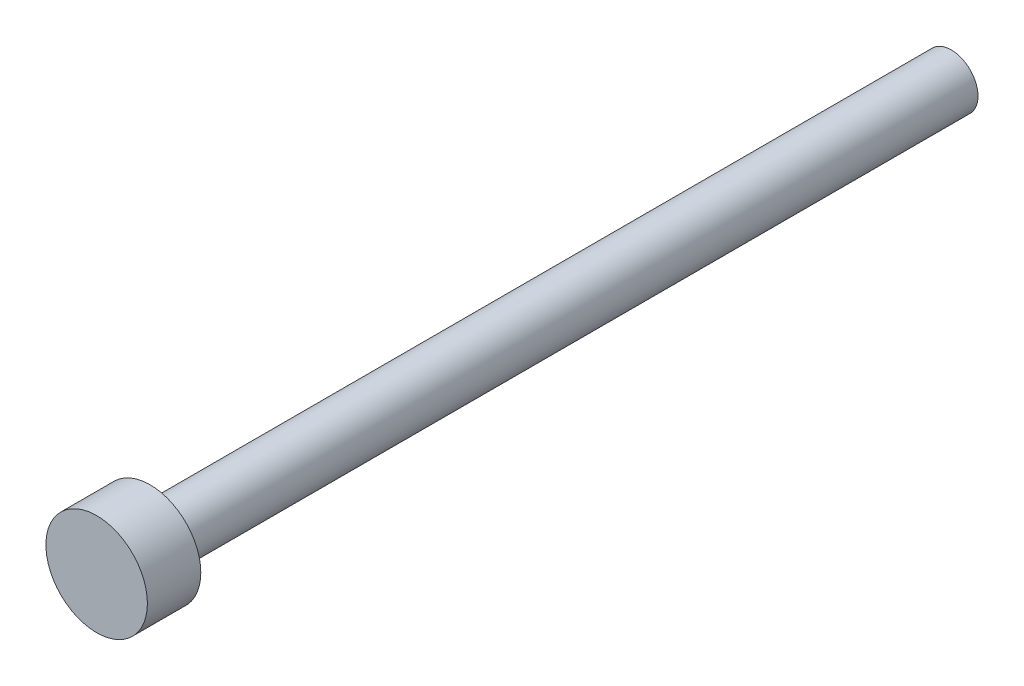
ISO-10303-21;
HEADER;
FILE_DESCRIPTION(('STEP AP214'),'2;1');
FILE_NAME('part.step','',(''),(''),'','','');
FILE_SCHEMA(('AUTOMOTIVE_DESIGN { 1 0 10303 214 1 1 1 1 }'));
ENDSEC;
DATA;
#1=APPLICATION_CONTEXT('core data for automotive mechanical design processes');
#2=APPLICATION_PROTOCOL_DEFINITION('international standard','automotive_design',2000,#1);
#3=PRODUCT_CONTEXT('',#1,'mechanical');
#4=PRODUCT('Part','Part','',(#3));
#5=PRODUCT_RELATED_PRODUCT_CATEGORY('part','',(#4));
#6=PRODUCT_DEFINITION_FORMATION('','',#4);
#7=PRODUCT_DEFINITION_CONTEXT('part definition',#1,'design');
#8=PRODUCT_DEFINITION('design','',#6,#7);
#9=PRODUCT_DEFINITION_SHAPE('','',#8);
#10=(LENGTH_UNIT() NAMED_UNIT(*) SI_UNIT(.MILLI.,.METRE.));
#11=(NAMED_UNIT(*) PLANE_ANGLE_UNIT() SI_UNIT($,.RADIAN.));
#12=(NAMED_UNIT(*) SI_UNIT($,.STERADIAN.) SOLID_ANGLE_UNIT());
#13=UNCERTAINTY_MEASURE_WITH_UNIT(LENGTH_MEASURE(1.E-05),#10,'distance_accuracy_value','');
#14=(GEOMETRIC_REPRESENTATION_CONTEXT(3) GLOBAL_UNCERTAINTY_ASSIGNED_CONTEXT((#13)) GLOBAL_UNIT_ASSIGNED_CONTEXT((#10,
#11,#12)) REPRESENTATION_CONTEXT('',''));
#15=CARTESIAN_POINT('',(0.,0.,0.));
#16=DIRECTION('',(0.,0.,1.));
#17=DIRECTION('',(1.,0.,0.));
#18=AXIS2_PLACEMENT_3D('',#15,#16,#17);
#19=CARTESIAN_POINT('',(0.,0.,0.));
#20=DIRECTION('',(0.,0.,-1.));
#21=DIRECTION('',(-1.,0.,0.));
#22=AXIS2_PLACEMENT_3D('',#19,#20,#21);
#23=CYLINDRICAL_SURFACE('',#22,1.);
#24=CARTESIAN_POINT('',(0.,0.,0.));
#25=DIRECTION('',(0.,0.,1.));
#26=DIRECTION('',(1.,0.,0.));
#27=AXIS2_PLACEMENT_3D('',#24,#25,#26);
#28=CIRCLE('',#27,1.);
#29=CARTESIAN_POINT('',(1.,0.,0.));
#30=VERTEX_POINT('',#29);
#31=EDGE_CURVE('E10',#30,#30,#28,.T.);
#32=ORIENTED_EDGE('',*,*,#31,.F.);
#33=EDGE_LOOP('',(#32));
#34=FACE_BOUND('',#33,.T.);
#35=CARTESIAN_POINT('',(0.,0.,-30.));
#36=DIRECTION('',(0.,0.,1.));
#37=DIRECTION('',(1.,0.,0.));
#38=AXIS2_PLACEMENT_3D('',#35,#36,#37);
#39=CIRCLE('',#38,1.);
#40=CARTESIAN_POINT('',(1.,0.,-30.));
#41=VERTEX_POINT('',#40);
#42=EDGE_CURVE('E37',#41,#41,#39,.T.);
#43=ORIENTED_EDGE('',*,*,#42,.T.);
#44=EDGE_LOOP('',(#43));
#45=FACE_BOUND('',#44,.T.);
#46=ADVANCED_FACE('F40',(#34,#45),#23,.T.);
#47=CARTESIAN_POINT('',(0.,0.,-30.));
#48=DIRECTION('',(0.,0.,1.));
#49=DIRECTION('',(1.,0.,0.));
#50=AXIS2_PLACEMENT_3D('',#47,#48,#49);
#51=PLANE('',#50);
#52=ORIENTED_EDGE('',*,*,#42,.F.);
#53=EDGE_LOOP('',(#52));
#54=FACE_BOUND('',#53,.T.);
#55=ADVANCED_FACE('F58',(#54),#51,.F.);
#56=CARTESIAN_POINT('',(0.,0.,2.));
#57=DIRECTION('',(0.,0.,-1.));
#58=DIRECTION('',(-1.,0.,0.));
#59=AXIS2_PLACEMENT_3D('',#56,#57,#58);
#60=CYLINDRICAL_SURFACE('',#59,1.9);
#61=CARTESIAN_POINT('',(0.,0.,2.));
#62=DIRECTION('',(0.,0.,1.));
#63=DIRECTION('',(1.,0.,0.));
#64=AXIS2_PLACEMENT_3D('',#61,#62,#63);
#65=CIRCLE('',#64,1.9);
#66=CARTESIAN_POINT('',(1.9,0.,2.));
#67=VERTEX_POINT('',#66);
#68=EDGE_CURVE('E50',#67,#67,#65,.T.);
#69=ORIENTED_EDGE('',*,*,#68,.F.);
#70=EDGE_LOOP('',(#69));
#71=FACE_BOUND('',#70,.T.);
#72=CARTESIAN_POINT('',(0.,0.,0.));
#73=DIRECTION('',(0.,0.,1.));
#74=DIRECTION('',(1.,0.,0.));
#75=AXIS2_PLACEMENT_3D('',#72,#73,#74);
#76=CIRCLE('',#75,1.9);
#77=CARTESIAN_POINT('',(1.9,0.,0.));
#78=VERTEX_POINT('',#77);
#79=EDGE_CURVE('E47',#78,#78,#76,.T.);
#80=ORIENTED_EDGE('',*,*,#79,.T.);
#81=EDGE_LOOP('',(#80));
#82=FACE_BOUND('',#81,.T.);
#83=ADVANCED_FACE('F60',(#71,#82),#60,.T.);
#84=CARTESIAN_POINT('',(0.,0.,2.));
#85=DIRECTION('',(0.,0.,1.));
#86=DIRECTION('',(1.,0.,0.));
#87=AXIS2_PLACEMENT_3D('',#84,#85,#86);
#88=PLANE('',#87);
#89=ORIENTED_EDGE('',*,*,#68,.T.);
#90=EDGE_LOOP('',(#89));
#91=FACE_BOUND('',#90,.T.);
#92=ADVANCED_FACE('F54',(#91),#88,.T.);
#93=CARTESIAN_POINT('',(0.,0.,0.));
#94=DIRECTION('',(0.,0.,1.));
#95=DIRECTION('',(1.,0.,0.));
#96=AXIS2_PLACEMENT_3D('',#93,#94,#95);
#97=PLANE('',#96);
#98=ORIENTED_EDGE('',*,*,#31,.T.);
#99=EDGE_LOOP('',(#98));
#100=FACE_BOUND('',#99,.T.);
#101=ORIENTED_EDGE('',*,*,#79,.F.);
#102=EDGE_LOOP('',(#101));
#103=FACE_BOUND('',#102,.T.);
#104=ADVANCED_FACE('F65',(#100,#103),#97,.F.);
#105=CLOSED_SHELL('',(#46,#55,#83,#92,#104));
#106=MANIFOLD_SOLID_BREP('B2',#105);
#107=ADVANCED_BREP_SHAPE_REPRESENTATION('',(#18,#106),#14);
#108=SHAPE_DEFINITION_REPRESENTATION(#9,#107);
ENDSEC;
END-ISO-10303-21;
